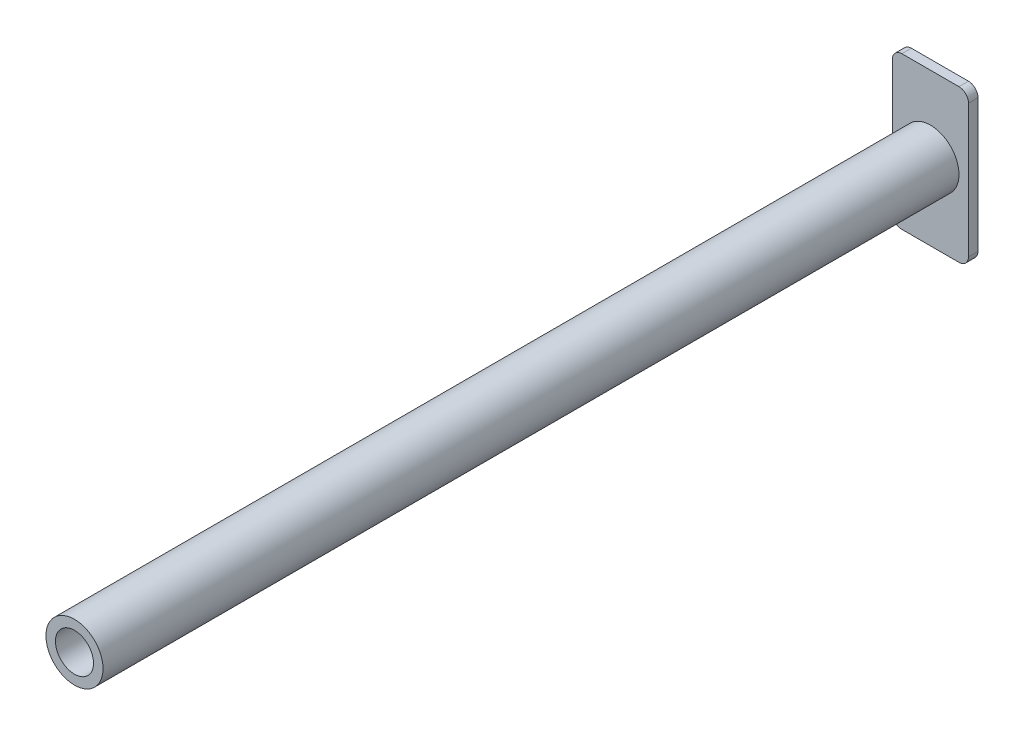
ISO-10303-21;
HEADER;
FILE_DESCRIPTION(('STEP AP214'),'2;1');
FILE_NAME('part.step','',(''),(''),'','','');
FILE_SCHEMA(('AUTOMOTIVE_DESIGN { 1 0 10303 214 1 1 1 1 }'));
ENDSEC;
DATA;
#1=APPLICATION_CONTEXT('core data for automotive mechanical design processes');
#2=APPLICATION_PROTOCOL_DEFINITION('international standard','automotive_design',2000,#1);
#3=PRODUCT_CONTEXT('',#1,'mechanical');
#4=PRODUCT('Part','Part','',(#3));
#5=PRODUCT_RELATED_PRODUCT_CATEGORY('part','',(#4));
#6=PRODUCT_DEFINITION_FORMATION('','',#4);
#7=PRODUCT_DEFINITION_CONTEXT('part definition',#1,'design');
#8=PRODUCT_DEFINITION('design','',#6,#7);
#9=PRODUCT_DEFINITION_SHAPE('','',#8);
#10=(LENGTH_UNIT() NAMED_UNIT(*) SI_UNIT(.MILLI.,.METRE.));
#11=(NAMED_UNIT(*) PLANE_ANGLE_UNIT() SI_UNIT($,.RADIAN.));
#12=(NAMED_UNIT(*) SI_UNIT($,.STERADIAN.) SOLID_ANGLE_UNIT());
#13=UNCERTAINTY_MEASURE_WITH_UNIT(LENGTH_MEASURE(1.E-05),#10,'distance_accuracy_value','');
#14=(GEOMETRIC_REPRESENTATION_CONTEXT(3) GLOBAL_UNCERTAINTY_ASSIGNED_CONTEXT((#13)) GLOBAL_UNIT_ASSIGNED_CONTEXT((#10,
#11,#12)) REPRESENTATION_CONTEXT('',''));
#15=CARTESIAN_POINT('',(0.,0.,0.));
#16=DIRECTION('',(0.,0.,1.));
#17=DIRECTION('',(1.,0.,0.));
#18=AXIS2_PLACEMENT_3D('',#15,#16,#17);
#19=CARTESIAN_POINT('',(40.,80.,10.));
#20=DIRECTION('',(-1.,0.,0.));
#21=DIRECTION('',(0.,-1.,0.));
#22=AXIS2_PLACEMENT_3D('',#19,#20,#21);
#23=PLANE('',#22);
#24=DIRECTION('',(0.,1.,0.));
#25=VECTOR('',#24,1.);
#26=CARTESIAN_POINT('',(40.,80.,10.));
#27=LINE('',#26,#25);
#28=CARTESIAN_POINT('',(40.,-70.,10.));
#29=VERTEX_POINT('',#28);
#30=CARTESIAN_POINT('',(40.,70.,10.));
#31=VERTEX_POINT('',#30);
#32=EDGE_CURVE('E118',#29,#31,#27,.T.);
#33=ORIENTED_EDGE('',*,*,#32,.F.);
#34=DIRECTION('',(0.,0.,-1.));
#35=VECTOR('',#34,1.);
#36=CARTESIAN_POINT('',(40.,-70.,10.));
#37=LINE('',#36,#35);
#38=CARTESIAN_POINT('',(40.,-70.,0.));
#39=VERTEX_POINT('',#38);
#40=EDGE_CURVE('E103',#29,#39,#37,.T.);
#41=ORIENTED_EDGE('',*,*,#40,.T.);
#42=DIRECTION('',(0.,1.,0.));
#43=VECTOR('',#42,1.);
#44=CARTESIAN_POINT('',(40.,80.,0.));
#45=LINE('',#44,#43);
#46=CARTESIAN_POINT('',(40.,70.,0.));
#47=VERTEX_POINT('',#46);
#48=EDGE_CURVE('E115',#39,#47,#45,.T.);
#49=ORIENTED_EDGE('',*,*,#48,.T.);
#50=DIRECTION('',(0.,0.,-1.));
#51=VECTOR('',#50,1.);
#52=CARTESIAN_POINT('',(40.,70.,10.));
#53=LINE('',#52,#51);
#54=EDGE_CURVE('E120',#47,#31,#53,.F.);
#55=ORIENTED_EDGE('',*,*,#54,.T.);
#56=EDGE_LOOP('',(#33,#41,#49,#55));
#57=FACE_BOUND('',#56,.T.);
#58=ADVANCED_FACE('F32',(#57),#23,.F.);
#59=CARTESIAN_POINT('',(-40.,80.,10.));
#60=DIRECTION('',(0.,-1.,0.));
#61=DIRECTION('',(0.,0.,-1.));
#62=AXIS2_PLACEMENT_3D('',#59,#60,#61);
#63=PLANE('',#62);
#64=DIRECTION('',(-1.,0.,0.));
#65=VECTOR('',#64,1.);
#66=CARTESIAN_POINT('',(-40.,80.,0.));
#67=LINE('',#66,#65);
#68=CARTESIAN_POINT('',(30.,80.,0.));
#69=VERTEX_POINT('',#68);
#70=CARTESIAN_POINT('',(-30.,80.,0.));
#71=VERTEX_POINT('',#70);
#72=EDGE_CURVE('E124',#69,#71,#67,.T.);
#73=ORIENTED_EDGE('',*,*,#72,.T.);
#74=DIRECTION('',(0.,0.,-1.));
#75=VECTOR('',#74,1.);
#76=CARTESIAN_POINT('',(-30.,80.,10.));
#77=LINE('',#76,#75);
#78=CARTESIAN_POINT('',(-30.,80.,10.));
#79=VERTEX_POINT('',#78);
#80=EDGE_CURVE('E40',#71,#79,#77,.F.);
#81=ORIENTED_EDGE('',*,*,#80,.T.);
#82=DIRECTION('',(-1.,0.,0.));
#83=VECTOR('',#82,1.);
#84=CARTESIAN_POINT('',(-40.,80.,10.));
#85=LINE('',#84,#83);
#86=CARTESIAN_POINT('',(30.,80.,10.));
#87=VERTEX_POINT('',#86);
#88=EDGE_CURVE('E165',#87,#79,#85,.T.);
#89=ORIENTED_EDGE('',*,*,#88,.F.);
#90=DIRECTION('',(0.,0.,-1.));
#91=VECTOR('',#90,1.);
#92=CARTESIAN_POINT('',(30.,80.,10.));
#93=LINE('',#92,#91);
#94=EDGE_CURVE('E159',#87,#69,#93,.T.);
#95=ORIENTED_EDGE('',*,*,#94,.T.);
#96=EDGE_LOOP('',(#73,#81,#89,#95));
#97=FACE_BOUND('',#96,.T.);
#98=ADVANCED_FACE('F164',(#97),#63,.F.);
#99=CARTESIAN_POINT('',(-40.,80.,10.));
#100=DIRECTION('',(1.,0.,0.));
#101=DIRECTION('',(0.,1.,0.));
#102=AXIS2_PLACEMENT_3D('',#99,#100,#101);
#103=PLANE('',#102);
#104=DIRECTION('',(0.,-1.,0.));
#105=VECTOR('',#104,1.);
#106=CARTESIAN_POINT('',(-40.,80.,0.));
#107=LINE('',#106,#105);
#108=CARTESIAN_POINT('',(-40.,70.,0.));
#109=VERTEX_POINT('',#108);
#110=CARTESIAN_POINT('',(-40.,-70.,0.));
#111=VERTEX_POINT('',#110);
#112=EDGE_CURVE('E128',#109,#111,#107,.T.);
#113=ORIENTED_EDGE('',*,*,#112,.T.);
#114=DIRECTION('',(0.,0.,-1.));
#115=VECTOR('',#114,1.);
#116=CARTESIAN_POINT('',(-40.,-70.,10.));
#117=LINE('',#116,#115);
#118=CARTESIAN_POINT('',(-40.,-70.,10.));
#119=VERTEX_POINT('',#118);
#120=EDGE_CURVE('E47',#111,#119,#117,.F.);
#121=ORIENTED_EDGE('',*,*,#120,.T.);
#122=DIRECTION('',(0.,-1.,0.));
#123=VECTOR('',#122,1.);
#124=CARTESIAN_POINT('',(-40.,80.,10.));
#125=LINE('',#124,#123);
#126=CARTESIAN_POINT('',(-40.,70.,10.));
#127=VERTEX_POINT('',#126);
#128=EDGE_CURVE('E171',#127,#119,#125,.T.);
#129=ORIENTED_EDGE('',*,*,#128,.F.);
#130=DIRECTION('',(0.,0.,-1.));
#131=VECTOR('',#130,1.);
#132=CARTESIAN_POINT('',(-40.,70.,10.));
#133=LINE('',#132,#131);
#134=EDGE_CURVE('E155',#127,#109,#133,.T.);
#135=ORIENTED_EDGE('',*,*,#134,.T.);
#136=EDGE_LOOP('',(#113,#121,#129,#135));
#137=FACE_BOUND('',#136,.T.);
#138=ADVANCED_FACE('F176',(#137),#103,.F.);
#139=CARTESIAN_POINT('',(-40.,-80.,10.));
#140=DIRECTION('',(0.,1.,0.));
#141=DIRECTION('',(0.,0.,1.));
#142=AXIS2_PLACEMENT_3D('',#139,#140,#141);
#143=PLANE('',#142);
#144=DIRECTION('',(1.,0.,0.));
#145=VECTOR('',#144,1.);
#146=CARTESIAN_POINT('',(-40.,-80.,0.));
#147=LINE('',#146,#145);
#148=CARTESIAN_POINT('',(-30.,-80.,0.));
#149=VERTEX_POINT('',#148);
#150=CARTESIAN_POINT('',(30.,-80.,0.));
#151=VERTEX_POINT('',#150);
#152=EDGE_CURVE('E138',#149,#151,#147,.T.);
#153=ORIENTED_EDGE('',*,*,#152,.T.);
#154=DIRECTION('',(0.,0.,-1.));
#155=VECTOR('',#154,1.);
#156=CARTESIAN_POINT('',(30.,-80.,10.));
#157=LINE('',#156,#155);
#158=CARTESIAN_POINT('',(30.,-80.,10.));
#159=VERTEX_POINT('',#158);
#160=EDGE_CURVE('E104',#151,#159,#157,.F.);
#161=ORIENTED_EDGE('',*,*,#160,.T.);
#162=DIRECTION('',(1.,0.,0.));
#163=VECTOR('',#162,1.);
#164=CARTESIAN_POINT('',(-40.,-80.,10.));
#165=LINE('',#164,#163);
#166=CARTESIAN_POINT('',(-30.,-80.,10.));
#167=VERTEX_POINT('',#166);
#168=EDGE_CURVE('E134',#167,#159,#165,.T.);
#169=ORIENTED_EDGE('',*,*,#168,.F.);
#170=DIRECTION('',(0.,0.,-1.));
#171=VECTOR('',#170,1.);
#172=CARTESIAN_POINT('',(-30.,-80.,10.));
#173=LINE('',#172,#171);
#174=EDGE_CURVE('E109',#167,#149,#173,.T.);
#175=ORIENTED_EDGE('',*,*,#174,.T.);
#176=EDGE_LOOP('',(#153,#161,#169,#175));
#177=FACE_BOUND('',#176,.T.);
#178=ADVANCED_FACE('F183',(#177),#143,.F.);
#179=CARTESIAN_POINT('',(0.,0.,10.));
#180=DIRECTION('',(0.,0.,1.));
#181=DIRECTION('',(1.,0.,0.));
#182=AXIS2_PLACEMENT_3D('',#179,#180,#181);
#183=PLANE('',#182);
#184=CARTESIAN_POINT('',(0.,0.,10.));
#185=DIRECTION('',(0.,0.,1.));
#186=DIRECTION('',(1.,0.,0.));
#187=AXIS2_PLACEMENT_3D('',#184,#185,#186);
#188=CIRCLE('',#187,30.);
#189=CARTESIAN_POINT('',(30.,0.,10.));
#190=VERTEX_POINT('',#189);
#191=EDGE_CURVE('E131',#190,#190,#188,.T.);
#192=ORIENTED_EDGE('',*,*,#191,.F.);
#193=EDGE_LOOP('',(#192));
#194=FACE_BOUND('',#193,.T.);
#195=ORIENTED_EDGE('',*,*,#168,.T.);
#196=CARTESIAN_POINT('',(30.,-70.,10.));
#197=DIRECTION('',(0.,0.,1.));
#198=DIRECTION('',(1.,0.,0.));
#199=AXIS2_PLACEMENT_3D('',#196,#197,#198);
#200=CIRCLE('',#199,10.);
#201=EDGE_CURVE('E153',#159,#29,#200,.T.);
#202=ORIENTED_EDGE('',*,*,#201,.T.);
#203=ORIENTED_EDGE('',*,*,#32,.T.);
#204=CARTESIAN_POINT('',(30.,70.,10.));
#205=DIRECTION('',(0.,0.,1.));
#206=DIRECTION('',(1.,0.,0.));
#207=AXIS2_PLACEMENT_3D('',#204,#205,#206);
#208=CIRCLE('',#207,10.);
#209=EDGE_CURVE('E148',#31,#87,#208,.T.);
#210=ORIENTED_EDGE('',*,*,#209,.T.);
#211=ORIENTED_EDGE('',*,*,#88,.T.);
#212=CARTESIAN_POINT('',(-30.,70.,10.));
#213=DIRECTION('',(0.,0.,1.));
#214=DIRECTION('',(1.,0.,0.));
#215=AXIS2_PLACEMENT_3D('',#212,#213,#214);
#216=CIRCLE('',#215,10.);
#217=EDGE_CURVE('E54',#79,#127,#216,.T.);
#218=ORIENTED_EDGE('',*,*,#217,.T.);
#219=ORIENTED_EDGE('',*,*,#128,.T.);
#220=CARTESIAN_POINT('',(-30.,-70.,10.));
#221=DIRECTION('',(0.,0.,1.));
#222=DIRECTION('',(1.,0.,0.));
#223=AXIS2_PLACEMENT_3D('',#220,#221,#222);
#224=CIRCLE('',#223,10.);
#225=EDGE_CURVE('E151',#119,#167,#224,.T.);
#226=ORIENTED_EDGE('',*,*,#225,.T.);
#227=EDGE_LOOP('',(#195,#202,#203,#210,#211,#218,#219,#226));
#228=FACE_BOUND('',#227,.T.);
#229=ADVANCED_FACE('F169',(#194,#228),#183,.T.);
#230=CARTESIAN_POINT('',(0.,0.,0.));
#231=DIRECTION('',(0.,0.,1.));
#232=DIRECTION('',(1.,0.,0.));
#233=AXIS2_PLACEMENT_3D('',#230,#231,#232);
#234=PLANE('',#233);
#235=ORIENTED_EDGE('',*,*,#48,.F.);
#236=CARTESIAN_POINT('',(30.,-70.,0.));
#237=DIRECTION('',(0.,0.,1.));
#238=DIRECTION('',(1.,0.,0.));
#239=AXIS2_PLACEMENT_3D('',#236,#237,#238);
#240=CIRCLE('',#239,10.);
#241=EDGE_CURVE('E99',#39,#151,#240,.F.);
#242=ORIENTED_EDGE('',*,*,#241,.T.);
#243=ORIENTED_EDGE('',*,*,#152,.F.);
#244=CARTESIAN_POINT('',(-30.,-70.,0.));
#245=DIRECTION('',(0.,0.,1.));
#246=DIRECTION('',(1.,0.,0.));
#247=AXIS2_PLACEMENT_3D('',#244,#245,#246);
#248=CIRCLE('',#247,10.);
#249=EDGE_CURVE('E110',#149,#111,#248,.F.);
#250=ORIENTED_EDGE('',*,*,#249,.T.);
#251=ORIENTED_EDGE('',*,*,#112,.F.);
#252=CARTESIAN_POINT('',(-30.,70.,0.));
#253=DIRECTION('',(0.,0.,1.));
#254=DIRECTION('',(1.,0.,0.));
#255=AXIS2_PLACEMENT_3D('',#252,#253,#254);
#256=CIRCLE('',#255,10.);
#257=EDGE_CURVE('E142',#109,#71,#256,.F.);
#258=ORIENTED_EDGE('',*,*,#257,.T.);
#259=ORIENTED_EDGE('',*,*,#72,.F.);
#260=CARTESIAN_POINT('',(30.,70.,0.));
#261=DIRECTION('',(0.,0.,1.));
#262=DIRECTION('',(1.,0.,0.));
#263=AXIS2_PLACEMENT_3D('',#260,#261,#262);
#264=CIRCLE('',#263,10.);
#265=EDGE_CURVE('E119',#69,#47,#264,.F.);
#266=ORIENTED_EDGE('',*,*,#265,.T.);
#267=EDGE_LOOP('',(#235,#242,#243,#250,#251,#258,#259,#266));
#268=FACE_BOUND('',#267,.T.);
#269=ADVANCED_FACE('F122',(#268),#234,.F.);
#270=CARTESIAN_POINT('',(30.,-70.,10.));
#271=DIRECTION('',(0.,0.,-1.));
#272=DIRECTION('',(-1.,0.,0.));
#273=AXIS2_PLACEMENT_3D('',#270,#271,#272);
#274=CYLINDRICAL_SURFACE('',#273,10.);
#275=ORIENTED_EDGE('',*,*,#201,.F.);
#276=ORIENTED_EDGE('',*,*,#160,.F.);
#277=ORIENTED_EDGE('',*,*,#241,.F.);
#278=ORIENTED_EDGE('',*,*,#40,.F.);
#279=EDGE_LOOP('',(#275,#276,#277,#278));
#280=FACE_BOUND('',#279,.T.);
#281=ADVANCED_FACE('F102',(#280),#274,.T.);
#282=CARTESIAN_POINT('',(-30.,-70.,10.));
#283=DIRECTION('',(0.,0.,-1.));
#284=DIRECTION('',(-1.,0.,0.));
#285=AXIS2_PLACEMENT_3D('',#282,#283,#284);
#286=CYLINDRICAL_SURFACE('',#285,10.);
#287=ORIENTED_EDGE('',*,*,#225,.F.);
#288=ORIENTED_EDGE('',*,*,#120,.F.);
#289=ORIENTED_EDGE('',*,*,#249,.F.);
#290=ORIENTED_EDGE('',*,*,#174,.F.);
#291=EDGE_LOOP('',(#287,#288,#289,#290));
#292=FACE_BOUND('',#291,.T.);
#293=ADVANCED_FACE('F180',(#292),#286,.T.);
#294=CARTESIAN_POINT('',(-30.,70.,10.));
#295=DIRECTION('',(0.,0.,-1.));
#296=DIRECTION('',(-1.,0.,0.));
#297=AXIS2_PLACEMENT_3D('',#294,#295,#296);
#298=CYLINDRICAL_SURFACE('',#297,10.);
#299=ORIENTED_EDGE('',*,*,#217,.F.);
#300=ORIENTED_EDGE('',*,*,#80,.F.);
#301=ORIENTED_EDGE('',*,*,#257,.F.);
#302=ORIENTED_EDGE('',*,*,#134,.F.);
#303=EDGE_LOOP('',(#299,#300,#301,#302));
#304=FACE_BOUND('',#303,.T.);
#305=ADVANCED_FACE('F174',(#304),#298,.T.);
#306=CARTESIAN_POINT('',(30.,70.,10.));
#307=DIRECTION('',(0.,0.,-1.));
#308=DIRECTION('',(-1.,0.,0.));
#309=AXIS2_PLACEMENT_3D('',#306,#307,#308);
#310=CYLINDRICAL_SURFACE('',#309,10.);
#311=ORIENTED_EDGE('',*,*,#209,.F.);
#312=ORIENTED_EDGE('',*,*,#54,.F.);
#313=ORIENTED_EDGE('',*,*,#265,.F.);
#314=ORIENTED_EDGE('',*,*,#94,.F.);
#315=EDGE_LOOP('',(#311,#312,#313,#314));
#316=FACE_BOUND('',#315,.T.);
#317=ADVANCED_FACE('F34',(#316),#310,.T.);
#318=CARTESIAN_POINT('',(0.,0.,910.));
#319=DIRECTION('',(0.,0.,1.));
#320=DIRECTION('',(1.,0.,0.));
#321=AXIS2_PLACEMENT_3D('',#318,#319,#320);
#322=PLANE('',#321);
#323=CARTESIAN_POINT('',(0.,0.,910.));
#324=DIRECTION('',(0.,0.,1.));
#325=DIRECTION('',(1.,0.,0.));
#326=AXIS2_PLACEMENT_3D('',#323,#324,#325);
#327=CIRCLE('',#326,30.);
#328=CARTESIAN_POINT('',(30.,0.,910.));
#329=VERTEX_POINT('',#328);
#330=EDGE_CURVE('E125',#329,#329,#327,.T.);
#331=ORIENTED_EDGE('',*,*,#330,.T.);
#332=EDGE_LOOP('',(#331));
#333=FACE_BOUND('',#332,.T.);
#334=CARTESIAN_POINT('',(0.,0.,910.));
#335=DIRECTION('',(0.,0.,1.));
#336=DIRECTION('',(1.,0.,0.));
#337=AXIS2_PLACEMENT_3D('',#334,#335,#336);
#338=CIRCLE('',#337,20.);
#339=CARTESIAN_POINT('',(20.,0.,910.));
#340=VERTEX_POINT('',#339);
#341=EDGE_CURVE('E187',#340,#340,#338,.T.);
#342=ORIENTED_EDGE('',*,*,#341,.F.);
#343=EDGE_LOOP('',(#342));
#344=FACE_BOUND('',#343,.T.);
#345=ADVANCED_FACE('F195',(#333,#344),#322,.T.);
#346=CARTESIAN_POINT('',(0.,0.,910.));
#347=DIRECTION('',(0.,0.,-1.));
#348=DIRECTION('',(-1.,0.,0.));
#349=AXIS2_PLACEMENT_3D('',#346,#347,#348);
#350=CYLINDRICAL_SURFACE('',#349,30.);
#351=ORIENTED_EDGE('',*,*,#330,.F.);
#352=EDGE_LOOP('',(#351));
#353=FACE_BOUND('',#352,.T.);
#354=ORIENTED_EDGE('',*,*,#191,.T.);
#355=EDGE_LOOP('',(#354));
#356=FACE_BOUND('',#355,.T.);
#357=ADVANCED_FACE('F197',(#353,#356),#350,.T.);
#358=CARTESIAN_POINT('',(0.,0.,910.));
#359=DIRECTION('',(0.,0.,-1.));
#360=DIRECTION('',(-1.,0.,0.));
#361=AXIS2_PLACEMENT_3D('',#358,#359,#360);
#362=CYLINDRICAL_SURFACE('',#361,20.);
#363=ORIENTED_EDGE('',*,*,#341,.T.);
#364=EDGE_LOOP('',(#363));
#365=FACE_BOUND('',#364,.T.);
#366=CARTESIAN_POINT('',(0.,0.,10.));
#367=DIRECTION('',(0.,0.,1.));
#368=DIRECTION('',(1.,0.,0.));
#369=AXIS2_PLACEMENT_3D('',#366,#367,#368);
#370=CIRCLE('',#369,20.);
#371=CARTESIAN_POINT('',(20.,0.,10.));
#372=VERTEX_POINT('',#371);
#373=EDGE_CURVE('E11',#372,#372,#370,.F.);
#374=ORIENTED_EDGE('',*,*,#373,.T.);
#375=EDGE_LOOP('',(#374));
#376=FACE_BOUND('',#375,.T.);
#377=ADVANCED_FACE('F192',(#365,#376),#362,.F.);
#378=ORIENTED_EDGE('',*,*,#373,.F.);
#379=EDGE_LOOP('',(#378));
#380=FACE_BOUND('',#379,.T.);
#381=ADVANCED_FACE('F239',(#380),#183,.T.);
#382=CLOSED_SHELL('',(#58,#98,#138,#178,#229,#269,#281,#293,#305,#317,#345,#357,#377,#381));
#383=MANIFOLD_SOLID_BREP('B2',#382);
#384=ADVANCED_BREP_SHAPE_REPRESENTATION('',(#18,#383),#14);
#385=SHAPE_DEFINITION_REPRESENTATION(#9,#384);
ENDSEC;
END-ISO-10303-21;
